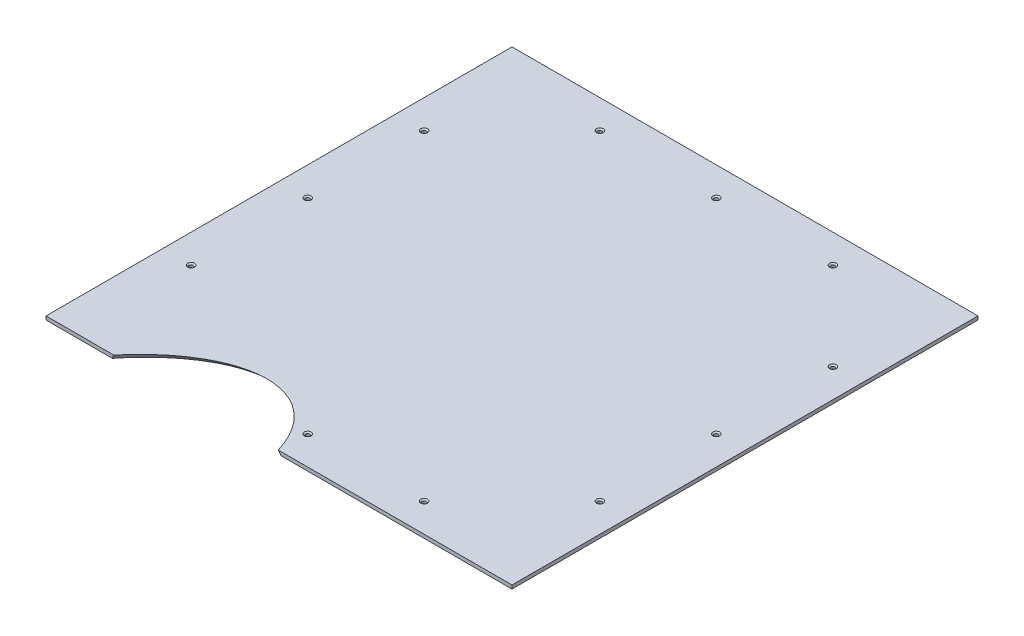
ISO-10303-21;
HEADER;
FILE_DESCRIPTION(('STEP AP214'),'2;1');
FILE_NAME('part.step','',(''),(''),'','','');
FILE_SCHEMA(('AUTOMOTIVE_DESIGN { 1 0 10303 214 1 1 1 1 }'));
ENDSEC;
DATA;
#1=APPLICATION_CONTEXT('core data for automotive mechanical design processes');
#2=APPLICATION_PROTOCOL_DEFINITION('international standard','automotive_design',2000,#1);
#3=PRODUCT_CONTEXT('',#1,'mechanical');
#4=PRODUCT('Part','Part','',(#3));
#5=PRODUCT_RELATED_PRODUCT_CATEGORY('part','',(#4));
#6=PRODUCT_DEFINITION_FORMATION('','',#4);
#7=PRODUCT_DEFINITION_CONTEXT('part definition',#1,'design');
#8=PRODUCT_DEFINITION('design','',#6,#7);
#9=PRODUCT_DEFINITION_SHAPE('','',#8);
#10=(LENGTH_UNIT() NAMED_UNIT(*) SI_UNIT(.MILLI.,.METRE.));
#11=(NAMED_UNIT(*) PLANE_ANGLE_UNIT() SI_UNIT($,.RADIAN.));
#12=(NAMED_UNIT(*) SI_UNIT($,.STERADIAN.) SOLID_ANGLE_UNIT());
#13=UNCERTAINTY_MEASURE_WITH_UNIT(LENGTH_MEASURE(1.E-05),#10,'distance_accuracy_value','');
#14=(GEOMETRIC_REPRESENTATION_CONTEXT(3) GLOBAL_UNCERTAINTY_ASSIGNED_CONTEXT((#13)) GLOBAL_UNIT_ASSIGNED_CONTEXT((#10,
#11,#12)) REPRESENTATION_CONTEXT('',''));
#15=CARTESIAN_POINT('',(0.,0.,0.));
#16=DIRECTION('',(0.,0.,1.));
#17=DIRECTION('',(1.,0.,0.));
#18=AXIS2_PLACEMENT_3D('',#15,#16,#17);
#19=CARTESIAN_POINT('',(103.375714,114.488214,103.375714));
#20=DIRECTION('',(0.,0.,1.));
#21=DIRECTION('',(-1.,0.,0.));
#22=AXIS2_PLACEMENT_3D('',#19,#20,#21);
#23=PLANE('',#22);
#24=CARTESIAN_POINT('',(-28.1609672696657,77.1828253907929,103.375714));
#25=DIRECTION('',(0.,0.,1.));
#26=DIRECTION('',(-0.474989701314118,0.879991354301578,0.));
#27=AXIS2_PLACEMENT_3D('',#24,#25,#26);
#28=ELLIPSE('',#27,62.480622920719,44.45);
#29=CARTESIAN_POINT('',(-73.3172487195405,114.488214,103.375714));
#30=VERTEX_POINT('',#29);
#31=CARTESIAN_POINT('',(-73.9528408774982,112.900714,103.375714));
#32=VERTEX_POINT('',#31);
#33=EDGE_CURVE('E47',#30,#32,#28,.T.);
#34=ORIENTED_EDGE('',*,*,#33,.F.);
#35=DIRECTION('',(-1.,0.,0.));
#36=VECTOR('',#35,1.);
#37=CARTESIAN_POINT('',(103.375714,114.488214,103.375714));
#38=LINE('',#37,#36);
#39=CARTESIAN_POINT('',(-103.375714,114.488214,103.375714));
#40=VERTEX_POINT('',#39);
#41=EDGE_CURVE('E127',#30,#40,#38,.T.);
#42=ORIENTED_EDGE('',*,*,#41,.T.);
#43=DIRECTION('',(0.,-1.,0.));
#44=VECTOR('',#43,1.);
#45=CARTESIAN_POINT('',(-103.375714,114.488214,103.375714));
#46=LINE('',#45,#44);
#47=CARTESIAN_POINT('',(-103.375714,112.900714,103.375714));
#48=VERTEX_POINT('',#47);
#49=EDGE_CURVE('E118',#40,#48,#46,.T.);
#50=ORIENTED_EDGE('',*,*,#49,.T.);
#51=DIRECTION('',(-1.,0.,0.));
#52=VECTOR('',#51,1.);
#53=CARTESIAN_POINT('',(103.375714,112.900714,103.375714));
#54=LINE('',#53,#52);
#55=EDGE_CURVE('E105',#32,#48,#54,.T.);
#56=ORIENTED_EDGE('',*,*,#55,.F.);
#57=EDGE_LOOP('',(#34,#42,#50,#56));
#58=FACE_BOUND('',#57,.T.);
#59=ADVANCED_FACE('F32',(#58),#23,.T.);
#60=CARTESIAN_POINT('',(103.375714,114.488214,103.375714));
#61=DIRECTION('',(1.,0.,0.));
#62=DIRECTION('',(0.,0.,1.));
#63=AXIS2_PLACEMENT_3D('',#60,#61,#62);
#64=PLANE('',#63);
#65=DIRECTION('',(0.,0.,1.));
#66=VECTOR('',#65,1.);
#67=CARTESIAN_POINT('',(103.375714,112.900714,103.375714));
#68=LINE('',#67,#66);
#69=CARTESIAN_POINT('',(103.375714,112.900714,-103.375714));
#70=VERTEX_POINT('',#69);
#71=CARTESIAN_POINT('',(103.375714,112.900714,103.375714));
#72=VERTEX_POINT('',#71);
#73=EDGE_CURVE('E103',#70,#72,#68,.T.);
#74=ORIENTED_EDGE('',*,*,#73,.F.);
#75=DIRECTION('',(0.,-1.,0.));
#76=VECTOR('',#75,1.);
#77=CARTESIAN_POINT('',(103.375714,114.488214,-103.375714));
#78=LINE('',#77,#76);
#79=CARTESIAN_POINT('',(103.375714,114.488214,-103.375714));
#80=VERTEX_POINT('',#79);
#81=EDGE_CURVE('E40',#80,#70,#78,.T.);
#82=ORIENTED_EDGE('',*,*,#81,.F.);
#83=DIRECTION('',(0.,0.,1.));
#84=VECTOR('',#83,1.);
#85=CARTESIAN_POINT('',(103.375714,114.488214,103.375714));
#86=LINE('',#85,#84);
#87=CARTESIAN_POINT('',(103.375714,114.488214,103.375714));
#88=VERTEX_POINT('',#87);
#89=EDGE_CURVE('E114',#80,#88,#86,.T.);
#90=ORIENTED_EDGE('',*,*,#89,.T.);
#91=DIRECTION('',(0.,-1.,0.));
#92=VECTOR('',#91,1.);
#93=CARTESIAN_POINT('',(103.375714,114.488214,103.375714));
#94=LINE('',#93,#92);
#95=EDGE_CURVE('E80',#88,#72,#94,.T.);
#96=ORIENTED_EDGE('',*,*,#95,.T.);
#97=EDGE_LOOP('',(#74,#82,#90,#96));
#98=FACE_BOUND('',#97,.T.);
#99=ADVANCED_FACE('F34',(#98),#64,.T.);
#100=CARTESIAN_POINT('',(103.375714,114.488214,-103.375714));
#101=DIRECTION('',(0.,0.,-1.));
#102=DIRECTION('',(1.,0.,0.));
#103=AXIS2_PLACEMENT_3D('',#100,#101,#102);
#104=PLANE('',#103);
#105=DIRECTION('',(1.,0.,0.));
#106=VECTOR('',#105,1.);
#107=CARTESIAN_POINT('',(103.375714,112.900714,-103.375714));
#108=LINE('',#107,#106);
#109=CARTESIAN_POINT('',(-103.375714,112.900714,-103.375714));
#110=VERTEX_POINT('',#109);
#111=EDGE_CURVE('E108',#110,#70,#108,.T.);
#112=ORIENTED_EDGE('',*,*,#111,.F.);
#113=DIRECTION('',(0.,-1.,0.));
#114=VECTOR('',#113,1.);
#115=CARTESIAN_POINT('',(-103.375714,114.488214,-103.375714));
#116=LINE('',#115,#114);
#117=CARTESIAN_POINT('',(-103.375714,114.488214,-103.375714));
#118=VERTEX_POINT('',#117);
#119=EDGE_CURVE('E116',#118,#110,#116,.T.);
#120=ORIENTED_EDGE('',*,*,#119,.F.);
#121=DIRECTION('',(1.,0.,0.));
#122=VECTOR('',#121,1.);
#123=CARTESIAN_POINT('',(103.375714,114.488214,-103.375714));
#124=LINE('',#123,#122);
#125=EDGE_CURVE('E120',#118,#80,#124,.T.);
#126=ORIENTED_EDGE('',*,*,#125,.T.);
#127=ORIENTED_EDGE('',*,*,#81,.T.);
#128=EDGE_LOOP('',(#112,#120,#126,#127));
#129=FACE_BOUND('',#128,.T.);
#130=ADVANCED_FACE('F239',(#129),#104,.T.);
#131=CARTESIAN_POINT('',(-103.375714,114.488214,103.375714));
#132=DIRECTION('',(-1.,0.,0.));
#133=DIRECTION('',(0.,0.,-1.));
#134=AXIS2_PLACEMENT_3D('',#131,#132,#133);
#135=PLANE('',#134);
#136=DIRECTION('',(0.,0.,-1.));
#137=VECTOR('',#136,1.);
#138=CARTESIAN_POINT('',(-103.375714,112.900714,103.375714));
#139=LINE('',#138,#137);
#140=EDGE_CURVE('E104',#48,#110,#139,.T.);
#141=ORIENTED_EDGE('',*,*,#140,.F.);
#142=ORIENTED_EDGE('',*,*,#49,.F.);
#143=DIRECTION('',(0.,0.,-1.));
#144=VECTOR('',#143,1.);
#145=CARTESIAN_POINT('',(-103.375714,114.488214,103.375714));
#146=LINE('',#145,#144);
#147=EDGE_CURVE('E121',#40,#118,#146,.T.);
#148=ORIENTED_EDGE('',*,*,#147,.T.);
#149=ORIENTED_EDGE('',*,*,#119,.T.);
#150=EDGE_LOOP('',(#141,#142,#148,#149));
#151=FACE_BOUND('',#150,.T.);
#152=ADVANCED_FACE('F238',(#151),#135,.T.);
#153=CARTESIAN_POINT('',(1.03475463813854,112.900714,103.375714));
#154=VERTEX_POINT('',#153);
#155=CARTESIAN_POINT('',(-0.338462050542609,114.488214,103.375714));
#156=VERTEX_POINT('',#155);
#157=EDGE_CURVE('E91',#154,#156,#28,.T.);
#158=ORIENTED_EDGE('',*,*,#157,.F.);
#159=EDGE_CURVE('E97',#72,#154,#54,.T.);
#160=ORIENTED_EDGE('',*,*,#159,.F.);
#161=ORIENTED_EDGE('',*,*,#95,.F.);
#162=EDGE_CURVE('E99',#88,#156,#38,.T.);
#163=ORIENTED_EDGE('',*,*,#162,.T.);
#164=EDGE_LOOP('',(#158,#160,#161,#163));
#165=FACE_BOUND('',#164,.T.);
#166=ADVANCED_FACE('F96',(#165),#23,.T.);
#167=CARTESIAN_POINT('',(103.375714,114.488214,-103.375714));
#168=DIRECTION('',(0.,1.,0.));
#169=DIRECTION('',(0.,0.,-1.));
#170=AXIS2_PLACEMENT_3D('',#167,#168,#169);
#171=PLANE('',#170);
#172=CARTESIAN_POINT('',(-48.29715986551,114.488214,146.290654475134));
#173=DIRECTION('',(0.,1.,0.));
#174=DIRECTION('',(-0.424776533342625,0.,0.905298236340612));
#175=AXIS2_PLACEMENT_3D('',#172,#173,#174);
#176=ELLIPSE('',#175,71.875734671484,44.45);
#177=EDGE_CURVE('E228',#156,#30,#176,.T.);
#178=ORIENTED_EDGE('',*,*,#177,.F.);
#179=ORIENTED_EDGE('',*,*,#162,.F.);
#180=ORIENTED_EDGE('',*,*,#89,.F.);
#181=ORIENTED_EDGE('',*,*,#125,.F.);
#182=ORIENTED_EDGE('',*,*,#147,.F.);
#183=ORIENTED_EDGE('',*,*,#41,.F.);
#184=EDGE_LOOP('',(#178,#179,#180,#181,#182,#183));
#185=FACE_BOUND('',#184,.T.);
#186=CARTESIAN_POINT('',(-90.6757140000005,114.488214,51.6878569999991));
#187=DIRECTION('',(0.,1.,0.));
#188=DIRECTION('',(0.,0.,-1.));
#189=AXIS2_PLACEMENT_3D('',#186,#187,#188);
#190=CIRCLE('',#189,1.51130000000001);
#191=CARTESIAN_POINT('',(-90.6757140000005,114.488214,50.1765569999991));
#192=VERTEX_POINT('',#191);
#193=EDGE_CURVE('E225',#192,#192,#190,.T.);
#194=ORIENTED_EDGE('',*,*,#193,.F.);
#195=EDGE_LOOP('',(#194));
#196=FACE_BOUND('',#195,.T.);
#197=CARTESIAN_POINT('',(-90.675714,114.488214,-9.36190769008373E-13));
#198=DIRECTION('',(0.,1.,0.));
#199=DIRECTION('',(0.,0.,-1.));
#200=AXIS2_PLACEMENT_3D('',#197,#198,#199);
#201=CIRCLE('',#200,1.51129999999999);
#202=CARTESIAN_POINT('',(-90.675714,114.488214,-1.51130000000093));
#203=VERTEX_POINT('',#202);
#204=EDGE_CURVE('E216',#203,#203,#201,.T.);
#205=ORIENTED_EDGE('',*,*,#204,.F.);
#206=EDGE_LOOP('',(#205));
#207=FACE_BOUND('',#206,.T.);
#208=CARTESIAN_POINT('',(-90.6757139999995,114.488214,-51.687857000001));
#209=DIRECTION('',(0.,1.,0.));
#210=DIRECTION('',(0.,0.,-1.));
#211=AXIS2_PLACEMENT_3D('',#208,#209,#210);
#212=CIRCLE('',#211,1.51129999999999);
#213=CARTESIAN_POINT('',(-90.6757139999995,114.488214,-53.1991570000009));
#214=VERTEX_POINT('',#213);
#215=EDGE_CURVE('E207',#214,#214,#212,.T.);
#216=ORIENTED_EDGE('',*,*,#215,.F.);
#217=EDGE_LOOP('',(#216));
#218=FACE_BOUND('',#217,.T.);
#219=CARTESIAN_POINT('',(51.6878569999994,114.488214,90.6757140000004));
#220=DIRECTION('',(0.,1.,0.));
#221=DIRECTION('',(0.,0.,-1.));
#222=AXIS2_PLACEMENT_3D('',#219,#220,#221);
#223=CIRCLE('',#222,1.5113);
#224=CARTESIAN_POINT('',(51.6878569999994,114.488214,89.1644140000004));
#225=VERTEX_POINT('',#224);
#226=EDGE_CURVE('E198',#225,#225,#223,.T.);
#227=ORIENTED_EDGE('',*,*,#226,.F.);
#228=EDGE_LOOP('',(#227));
#229=FACE_BOUND('',#228,.T.);
#230=CARTESIAN_POINT('',(-6.1959802232066E-13,114.488214,90.675714));
#231=DIRECTION('',(0.,1.,0.));
#232=DIRECTION('',(0.,0.,-1.));
#233=AXIS2_PLACEMENT_3D('',#230,#231,#232);
#234=CIRCLE('',#233,1.5113);
#235=CARTESIAN_POINT('',(-6.1959802232066E-13,114.488214,89.164414));
#236=VERTEX_POINT('',#235);
#237=EDGE_CURVE('E189',#236,#236,#234,.T.);
#238=ORIENTED_EDGE('',*,*,#237,.F.);
#239=EDGE_LOOP('',(#238));
#240=FACE_BOUND('',#239,.T.);
#241=CARTESIAN_POINT('',(90.6757140000002,114.488214,-51.6878569999997));
#242=DIRECTION('',(0.,1.,0.));
#243=DIRECTION('',(0.,0.,-1.));
#244=AXIS2_PLACEMENT_3D('',#241,#242,#243);
#245=CIRCLE('',#244,1.51130000000001);
#246=CARTESIAN_POINT('',(90.6757140000002,114.488214,-53.1991569999997));
#247=VERTEX_POINT('',#246);
#248=EDGE_CURVE('E180',#247,#247,#245,.T.);
#249=ORIENTED_EDGE('',*,*,#248,.F.);
#250=EDGE_LOOP('',(#249));
#251=FACE_BOUND('',#250,.T.);
#252=CARTESIAN_POINT('',(90.675714,114.488214,3.03005275632947E-13));
#253=DIRECTION('',(0.,1.,0.));
#254=DIRECTION('',(0.,0.,-1.));
#255=AXIS2_PLACEMENT_3D('',#252,#253,#254);
#256=CIRCLE('',#255,1.51129999999999);
#257=CARTESIAN_POINT('',(90.675714,114.488214,-1.51129999999969));
#258=VERTEX_POINT('',#257);
#259=EDGE_CURVE('E171',#258,#258,#256,.T.);
#260=ORIENTED_EDGE('',*,*,#259,.F.);
#261=EDGE_LOOP('',(#260));
#262=FACE_BOUND('',#261,.T.);
#263=CARTESIAN_POINT('',(90.6757139999998,114.488214,51.6878570000003));
#264=DIRECTION('',(0.,1.,0.));
#265=DIRECTION('',(0.,0.,-1.));
#266=AXIS2_PLACEMENT_3D('',#263,#264,#265);
#267=CIRCLE('',#266,1.51129999999999);
#268=CARTESIAN_POINT('',(90.6757139999998,114.488214,50.1765570000003));
#269=VERTEX_POINT('',#268);
#270=EDGE_CURVE('E162',#269,#269,#267,.T.);
#271=ORIENTED_EDGE('',*,*,#270,.F.);
#272=EDGE_LOOP('',(#271));
#273=FACE_BOUND('',#272,.T.);
#274=CARTESIAN_POINT('',(-51.687857,114.488214,-90.675714));
#275=DIRECTION('',(0.,1.,0.));
#276=DIRECTION('',(0.,0.,-1.));
#277=AXIS2_PLACEMENT_3D('',#274,#275,#276);
#278=CIRCLE('',#277,1.5113);
#279=CARTESIAN_POINT('',(-51.687857,114.488214,-92.187014));
#280=VERTEX_POINT('',#279);
#281=EDGE_CURVE('E153',#280,#280,#278,.T.);
#282=ORIENTED_EDGE('',*,*,#281,.F.);
#283=EDGE_LOOP('',(#282));
#284=FACE_BOUND('',#283,.T.);
#285=CARTESIAN_POINT('',(0.,114.488214,-90.675714));
#286=DIRECTION('',(0.,1.,0.));
#287=DIRECTION('',(0.,0.,-1.));
#288=AXIS2_PLACEMENT_3D('',#285,#286,#287);
#289=CIRCLE('',#288,1.5113);
#290=CARTESIAN_POINT('',(0.,114.488214,-92.187014));
#291=VERTEX_POINT('',#290);
#292=EDGE_CURVE('E144',#291,#291,#289,.T.);
#293=ORIENTED_EDGE('',*,*,#292,.F.);
#294=EDGE_LOOP('',(#293));
#295=FACE_BOUND('',#294,.T.);
#296=CARTESIAN_POINT('',(51.687857,114.488214,-90.675714));
#297=DIRECTION('',(0.,1.,0.));
#298=DIRECTION('',(0.,0.,-1.));
#299=AXIS2_PLACEMENT_3D('',#296,#297,#298);
#300=CIRCLE('',#299,1.5113);
#301=CARTESIAN_POINT('',(51.687857,114.488214,-92.187014));
#302=VERTEX_POINT('',#301);
#303=EDGE_CURVE('E135',#302,#302,#300,.T.);
#304=ORIENTED_EDGE('',*,*,#303,.F.);
#305=EDGE_LOOP('',(#304));
#306=FACE_BOUND('',#305,.T.);
#307=ADVANCED_FACE('F234',(#185,#196,#207,#218,#229,#240,#251,#262,#273,#284,#295,#306),#171,.T.);
#308=CARTESIAN_POINT('',(103.375714,112.900714,-103.375714));
#309=DIRECTION('',(0.,1.,0.));
#310=DIRECTION('',(0.,0.,-1.));
#311=AXIS2_PLACEMENT_3D('',#308,#309,#310);
#312=PLANE('',#311);
#313=CARTESIAN_POINT('',(-90.6757140000005,112.900714,51.6878569999991));
#314=DIRECTION('',(0.,1.,0.));
#315=DIRECTION('',(0.,0.,-1.));
#316=AXIS2_PLACEMENT_3D('',#313,#314,#315);
#317=CIRCLE('',#316,0.889000000000001);
#318=CARTESIAN_POINT('',(-90.6757140000005,112.900714,50.7988569999991));
#319=VERTEX_POINT('',#318);
#320=EDGE_CURVE('E219',#319,#319,#317,.T.);
#321=ORIENTED_EDGE('',*,*,#320,.T.);
#322=EDGE_LOOP('',(#321));
#323=FACE_BOUND('',#322,.T.);
#324=CARTESIAN_POINT('',(-90.675714,112.900714,-9.36190769008373E-13));
#325=DIRECTION('',(0.,1.,0.));
#326=DIRECTION('',(0.,0.,-1.));
#327=AXIS2_PLACEMENT_3D('',#324,#325,#326);
#328=CIRCLE('',#327,0.889000000000001);
#329=CARTESIAN_POINT('',(-90.675714,112.900714,-0.889000000000937));
#330=VERTEX_POINT('',#329);
#331=EDGE_CURVE('E210',#330,#330,#328,.T.);
#332=ORIENTED_EDGE('',*,*,#331,.T.);
#333=EDGE_LOOP('',(#332));
#334=FACE_BOUND('',#333,.T.);
#335=CARTESIAN_POINT('',(-90.6757139999995,112.900714,-51.687857000001));
#336=DIRECTION('',(0.,1.,0.));
#337=DIRECTION('',(0.,0.,-1.));
#338=AXIS2_PLACEMENT_3D('',#335,#336,#337);
#339=CIRCLE('',#338,0.889000000000001);
#340=CARTESIAN_POINT('',(-90.6757139999995,112.900714,-52.576857000001));
#341=VERTEX_POINT('',#340);
#342=EDGE_CURVE('E201',#341,#341,#339,.T.);
#343=ORIENTED_EDGE('',*,*,#342,.T.);
#344=EDGE_LOOP('',(#343));
#345=FACE_BOUND('',#344,.T.);
#346=CARTESIAN_POINT('',(51.6878569999994,112.900714,90.6757140000004));
#347=DIRECTION('',(0.,1.,0.));
#348=DIRECTION('',(0.,0.,-1.));
#349=AXIS2_PLACEMENT_3D('',#346,#347,#348);
#350=CIRCLE('',#349,0.889000000000001);
#351=CARTESIAN_POINT('',(51.6878569999994,112.900714,89.7867140000004));
#352=VERTEX_POINT('',#351);
#353=EDGE_CURVE('E192',#352,#352,#350,.T.);
#354=ORIENTED_EDGE('',*,*,#353,.T.);
#355=EDGE_LOOP('',(#354));
#356=FACE_BOUND('',#355,.T.);
#357=CARTESIAN_POINT('',(-6.1959802232066E-13,112.900714,90.675714));
#358=DIRECTION('',(0.,1.,0.));
#359=DIRECTION('',(0.,0.,-1.));
#360=AXIS2_PLACEMENT_3D('',#357,#358,#359);
#361=CIRCLE('',#360,0.889);
#362=CARTESIAN_POINT('',(-6.1959802232066E-13,112.900714,89.786714));
#363=VERTEX_POINT('',#362);
#364=EDGE_CURVE('E183',#363,#363,#361,.T.);
#365=ORIENTED_EDGE('',*,*,#364,.T.);
#366=EDGE_LOOP('',(#365));
#367=FACE_BOUND('',#366,.T.);
#368=CARTESIAN_POINT('',(90.6757140000002,112.900714,-51.6878569999997));
#369=DIRECTION('',(0.,1.,0.));
#370=DIRECTION('',(0.,0.,-1.));
#371=AXIS2_PLACEMENT_3D('',#368,#369,#370);
#372=CIRCLE('',#371,0.889000000000001);
#373=CARTESIAN_POINT('',(90.6757140000002,112.900714,-52.5768569999997));
#374=VERTEX_POINT('',#373);
#375=EDGE_CURVE('E174',#374,#374,#372,.T.);
#376=ORIENTED_EDGE('',*,*,#375,.T.);
#377=EDGE_LOOP('',(#376));
#378=FACE_BOUND('',#377,.T.);
#379=CARTESIAN_POINT('',(90.675714,112.900714,3.03005275632947E-13));
#380=DIRECTION('',(0.,1.,0.));
#381=DIRECTION('',(0.,0.,-1.));
#382=AXIS2_PLACEMENT_3D('',#379,#380,#381);
#383=CIRCLE('',#382,0.889000000000001);
#384=CARTESIAN_POINT('',(90.675714,112.900714,-0.888999999999698));
#385=VERTEX_POINT('',#384);
#386=EDGE_CURVE('E165',#385,#385,#383,.T.);
#387=ORIENTED_EDGE('',*,*,#386,.T.);
#388=EDGE_LOOP('',(#387));
#389=FACE_BOUND('',#388,.T.);
#390=CARTESIAN_POINT('',(90.6757139999998,112.900714,51.6878570000003));
#391=DIRECTION('',(0.,1.,0.));
#392=DIRECTION('',(0.,0.,-1.));
#393=AXIS2_PLACEMENT_3D('',#390,#391,#392);
#394=CIRCLE('',#393,0.889000000000001);
#395=CARTESIAN_POINT('',(90.6757139999998,112.900714,50.7988570000003));
#396=VERTEX_POINT('',#395);
#397=EDGE_CURVE('E156',#396,#396,#394,.T.);
#398=ORIENTED_EDGE('',*,*,#397,.T.);
#399=EDGE_LOOP('',(#398));
#400=FACE_BOUND('',#399,.T.);
#401=CARTESIAN_POINT('',(-51.687857,112.900714,-90.675714));
#402=DIRECTION('',(0.,1.,0.));
#403=DIRECTION('',(0.,0.,-1.));
#404=AXIS2_PLACEMENT_3D('',#401,#402,#403);
#405=CIRCLE('',#404,0.889000000000001);
#406=CARTESIAN_POINT('',(-51.687857,112.900714,-91.564714));
#407=VERTEX_POINT('',#406);
#408=EDGE_CURVE('E147',#407,#407,#405,.T.);
#409=ORIENTED_EDGE('',*,*,#408,.T.);
#410=EDGE_LOOP('',(#409));
#411=FACE_BOUND('',#410,.T.);
#412=CARTESIAN_POINT('',(0.,112.900714,-90.675714));
#413=DIRECTION('',(0.,1.,0.));
#414=DIRECTION('',(0.,0.,-1.));
#415=AXIS2_PLACEMENT_3D('',#412,#413,#414);
#416=CIRCLE('',#415,0.889);
#417=CARTESIAN_POINT('',(0.,112.900714,-91.564714));
#418=VERTEX_POINT('',#417);
#419=EDGE_CURVE('E138',#418,#418,#416,.T.);
#420=ORIENTED_EDGE('',*,*,#419,.T.);
#421=EDGE_LOOP('',(#420));
#422=FACE_BOUND('',#421,.T.);
#423=CARTESIAN_POINT('',(51.687857,112.900714,-90.675714));
#424=DIRECTION('',(0.,1.,0.));
#425=DIRECTION('',(0.,0.,-1.));
#426=AXIS2_PLACEMENT_3D('',#423,#424,#425);
#427=CIRCLE('',#426,0.889000000000001);
#428=CARTESIAN_POINT('',(51.687857,112.900714,-91.564714));
#429=VERTEX_POINT('',#428);
#430=EDGE_CURVE('E129',#429,#429,#427,.T.);
#431=ORIENTED_EDGE('',*,*,#430,.T.);
#432=EDGE_LOOP('',(#431));
#433=FACE_BOUND('',#432,.T.);
#434=ORIENTED_EDGE('',*,*,#159,.T.);
#435=CARTESIAN_POINT('',(-47.4402808210168,112.900714,144.464444628671));
#436=DIRECTION('',(0.,1.,0.));
#437=DIRECTION('',(-0.424776533342625,0.,0.905298236340612));
#438=AXIS2_PLACEMENT_3D('',#435,#436,#437);
#439=ELLIPSE('',#438,71.875734671484,44.45);
#440=EDGE_CURVE('E11',#154,#32,#439,.T.);
#441=ORIENTED_EDGE('',*,*,#440,.T.);
#442=ORIENTED_EDGE('',*,*,#55,.T.);
#443=ORIENTED_EDGE('',*,*,#140,.T.);
#444=ORIENTED_EDGE('',*,*,#111,.T.);
#445=ORIENTED_EDGE('',*,*,#73,.T.);
#446=EDGE_LOOP('',(#434,#441,#442,#443,#444,#445));
#447=FACE_BOUND('',#446,.T.);
#448=ADVANCED_FACE('F101',(#323,#334,#345,#356,#367,#378,#389,#400,#411,#422,#433,#447),#312,.F.);
#449=CARTESIAN_POINT('',(51.687857,114.488214,-90.675714));
#450=DIRECTION('',(0.,1.,0.));
#451=DIRECTION('',(0.,0.,-1.));
#452=AXIS2_PLACEMENT_3D('',#449,#450,#451);
#453=CYLINDRICAL_SURFACE('',#452,0.888999999999997);
#454=ORIENTED_EDGE('',*,*,#430,.F.);
#455=EDGE_LOOP('',(#454));
#456=FACE_BOUND('',#455,.T.);
#457=CARTESIAN_POINT('',(51.687857,113.966042299518,-90.675714));
#458=DIRECTION('',(0.,1.,0.));
#459=DIRECTION('',(0.,0.,-1.));
#460=AXIS2_PLACEMENT_3D('',#457,#458,#459);
#461=CIRCLE('',#460,0.888999999999994);
#462=CARTESIAN_POINT('',(51.687857,113.966042299518,-91.564714));
#463=VERTEX_POINT('',#462);
#464=EDGE_CURVE('E132',#463,#463,#461,.T.);
#465=ORIENTED_EDGE('',*,*,#464,.T.);
#466=EDGE_LOOP('',(#465));
#467=FACE_BOUND('',#466,.T.);
#468=ADVANCED_FACE('F259',(#456,#467),#453,.F.);
#469=CARTESIAN_POINT('',(51.687857,114.488214,-90.675714));
#470=DIRECTION('',(0.,1.,0.));
#471=DIRECTION('',(0.,0.,-1.));
#472=AXIS2_PLACEMENT_3D('',#469,#470,#471);
#473=CONICAL_SURFACE('',#472,1.5113,0.872664625997172);
#474=ORIENTED_EDGE('',*,*,#464,.F.);
#475=EDGE_LOOP('',(#474));
#476=FACE_BOUND('',#475,.T.);
#477=ORIENTED_EDGE('',*,*,#303,.T.);
#478=EDGE_LOOP('',(#477));
#479=FACE_BOUND('',#478,.T.);
#480=ADVANCED_FACE('F264',(#476,#479),#473,.F.);
#481=CARTESIAN_POINT('',(0.,114.488214,-90.675714));
#482=DIRECTION('',(0.,1.,0.));
#483=DIRECTION('',(0.,0.,-1.));
#484=AXIS2_PLACEMENT_3D('',#481,#482,#483);
#485=CYLINDRICAL_SURFACE('',#484,0.888999999999998);
#486=ORIENTED_EDGE('',*,*,#419,.F.);
#487=EDGE_LOOP('',(#486));
#488=FACE_BOUND('',#487,.T.);
#489=CARTESIAN_POINT('',(0.,113.966042299518,-90.675714));
#490=DIRECTION('',(0.,1.,0.));
#491=DIRECTION('',(0.,0.,-1.));
#492=AXIS2_PLACEMENT_3D('',#489,#490,#491);
#493=CIRCLE('',#492,0.888999999999997);
#494=CARTESIAN_POINT('',(0.,113.966042299518,-91.564714));
#495=VERTEX_POINT('',#494);
#496=EDGE_CURVE('E141',#495,#495,#493,.T.);
#497=ORIENTED_EDGE('',*,*,#496,.T.);
#498=EDGE_LOOP('',(#497));
#499=FACE_BOUND('',#498,.T.);
#500=ADVANCED_FACE('F268',(#488,#499),#485,.F.);
#501=CARTESIAN_POINT('',(0.,114.488214,-90.675714));
#502=DIRECTION('',(0.,1.,0.));
#503=DIRECTION('',(0.,0.,-1.));
#504=AXIS2_PLACEMENT_3D('',#501,#502,#503);
#505=CONICAL_SURFACE('',#504,1.5113,0.87266462599717);
#506=ORIENTED_EDGE('',*,*,#496,.F.);
#507=EDGE_LOOP('',(#506));
#508=FACE_BOUND('',#507,.T.);
#509=ORIENTED_EDGE('',*,*,#292,.T.);
#510=EDGE_LOOP('',(#509));
#511=FACE_BOUND('',#510,.T.);
#512=ADVANCED_FACE('F272',(#508,#511),#505,.F.);
#513=CARTESIAN_POINT('',(-51.687857,114.488214,-90.675714));
#514=DIRECTION('',(0.,1.,0.));
#515=DIRECTION('',(0.,0.,-1.));
#516=AXIS2_PLACEMENT_3D('',#513,#514,#515);
#517=CYLINDRICAL_SURFACE('',#516,0.888999999999997);
#518=ORIENTED_EDGE('',*,*,#408,.F.);
#519=EDGE_LOOP('',(#518));
#520=FACE_BOUND('',#519,.T.);
#521=CARTESIAN_POINT('',(-51.687857,113.966042299518,-90.675714));
#522=DIRECTION('',(0.,1.,0.));
#523=DIRECTION('',(0.,0.,-1.));
#524=AXIS2_PLACEMENT_3D('',#521,#522,#523);
#525=CIRCLE('',#524,0.888999999999994);
#526=CARTESIAN_POINT('',(-51.687857,113.966042299518,-91.564714));
#527=VERTEX_POINT('',#526);
#528=EDGE_CURVE('E150',#527,#527,#525,.T.);
#529=ORIENTED_EDGE('',*,*,#528,.T.);
#530=EDGE_LOOP('',(#529));
#531=FACE_BOUND('',#530,.T.);
#532=ADVANCED_FACE('F276',(#520,#531),#517,.F.);
#533=CARTESIAN_POINT('',(-51.687857,114.488214,-90.675714));
#534=DIRECTION('',(0.,1.,0.));
#535=DIRECTION('',(0.,0.,-1.));
#536=AXIS2_PLACEMENT_3D('',#533,#534,#535);
#537=CONICAL_SURFACE('',#536,1.5113,0.872664625997172);
#538=ORIENTED_EDGE('',*,*,#528,.F.);
#539=EDGE_LOOP('',(#538));
#540=FACE_BOUND('',#539,.T.);
#541=ORIENTED_EDGE('',*,*,#281,.T.);
#542=EDGE_LOOP('',(#541));
#543=FACE_BOUND('',#542,.T.);
#544=ADVANCED_FACE('F280',(#540,#543),#537,.F.);
#545=CARTESIAN_POINT('',(90.6757139999998,114.488214,51.6878570000003));
#546=DIRECTION('',(0.,1.,0.));
#547=DIRECTION('',(0.,0.,-1.));
#548=AXIS2_PLACEMENT_3D('',#545,#546,#547);
#549=CYLINDRICAL_SURFACE('',#548,0.889000000000001);
#550=ORIENTED_EDGE('',*,*,#397,.F.);
#551=EDGE_LOOP('',(#550));
#552=FACE_BOUND('',#551,.T.);
#553=CARTESIAN_POINT('',(90.6757139999998,113.966042299518,51.6878570000003));
#554=DIRECTION('',(0.,1.,0.));
#555=DIRECTION('',(0.,0.,-1.));
#556=AXIS2_PLACEMENT_3D('',#553,#554,#555);
#557=CIRCLE('',#556,0.889000000000001);
#558=CARTESIAN_POINT('',(90.6757139999998,113.966042299518,50.7988570000003));
#559=VERTEX_POINT('',#558);
#560=EDGE_CURVE('E159',#559,#559,#557,.T.);
#561=ORIENTED_EDGE('',*,*,#560,.T.);
#562=EDGE_LOOP('',(#561));
#563=FACE_BOUND('',#562,.T.);
#564=ADVANCED_FACE('F284',(#552,#563),#549,.F.);
#565=CARTESIAN_POINT('',(90.6757139999998,114.488214,51.6878570000003));
#566=DIRECTION('',(0.,1.,0.));
#567=DIRECTION('',(0.,0.,-1.));
#568=AXIS2_PLACEMENT_3D('',#565,#566,#567);
#569=CONICAL_SURFACE('',#568,1.51129999999999,0.872664625997161);
#570=ORIENTED_EDGE('',*,*,#560,.F.);
#571=EDGE_LOOP('',(#570));
#572=FACE_BOUND('',#571,.T.);
#573=ORIENTED_EDGE('',*,*,#270,.T.);
#574=EDGE_LOOP('',(#573));
#575=FACE_BOUND('',#574,.T.);
#576=ADVANCED_FACE('F288',(#572,#575),#569,.F.);
#577=CARTESIAN_POINT('',(90.675714,114.488214,3.03005275632947E-13));
#578=DIRECTION('',(0.,1.,0.));
#579=DIRECTION('',(0.,0.,-1.));
#580=AXIS2_PLACEMENT_3D('',#577,#578,#579);
#581=CYLINDRICAL_SURFACE('',#580,0.889000000000001);
#582=ORIENTED_EDGE('',*,*,#386,.F.);
#583=EDGE_LOOP('',(#582));
#584=FACE_BOUND('',#583,.T.);
#585=CARTESIAN_POINT('',(90.675714,113.966042299518,3.03005275632947E-13));
#586=DIRECTION('',(0.,1.,0.));
#587=DIRECTION('',(0.,0.,-1.));
#588=AXIS2_PLACEMENT_3D('',#585,#586,#587);
#589=CIRCLE('',#588,0.889000000000001);
#590=CARTESIAN_POINT('',(90.675714,113.966042299518,-0.888999999999698));
#591=VERTEX_POINT('',#590);
#592=EDGE_CURVE('E168',#591,#591,#589,.T.);
#593=ORIENTED_EDGE('',*,*,#592,.T.);
#594=EDGE_LOOP('',(#593));
#595=FACE_BOUND('',#594,.T.);
#596=ADVANCED_FACE('F292',(#584,#595),#581,.F.);
#597=CARTESIAN_POINT('',(90.675714,114.488214,3.03005275632947E-13));
#598=DIRECTION('',(0.,1.,0.));
#599=DIRECTION('',(0.,0.,-1.));
#600=AXIS2_PLACEMENT_3D('',#597,#598,#599);
#601=CONICAL_SURFACE('',#600,1.51129999999999,0.872664625997161);
#602=ORIENTED_EDGE('',*,*,#592,.F.);
#603=EDGE_LOOP('',(#602));
#604=FACE_BOUND('',#603,.T.);
#605=ORIENTED_EDGE('',*,*,#259,.T.);
#606=EDGE_LOOP('',(#605));
#607=FACE_BOUND('',#606,.T.);
#608=ADVANCED_FACE('F296',(#604,#607),#601,.F.);
#609=CARTESIAN_POINT('',(90.6757140000002,114.488214,-51.6878569999997));
#610=DIRECTION('',(0.,1.,0.));
#611=DIRECTION('',(0.,0.,-1.));
#612=AXIS2_PLACEMENT_3D('',#609,#610,#611);
#613=CYLINDRICAL_SURFACE('',#612,0.889000000000001);
#614=ORIENTED_EDGE('',*,*,#375,.F.);
#615=EDGE_LOOP('',(#614));
#616=FACE_BOUND('',#615,.T.);
#617=CARTESIAN_POINT('',(90.6757140000002,113.966042299518,-51.6878569999997));
#618=DIRECTION('',(0.,1.,0.));
#619=DIRECTION('',(0.,0.,-1.));
#620=AXIS2_PLACEMENT_3D('',#617,#618,#619);
#621=CIRCLE('',#620,0.889000000000001);
#622=CARTESIAN_POINT('',(90.6757140000002,113.966042299518,-52.5768569999997));
#623=VERTEX_POINT('',#622);
#624=EDGE_CURVE('E177',#623,#623,#621,.T.);
#625=ORIENTED_EDGE('',*,*,#624,.T.);
#626=EDGE_LOOP('',(#625));
#627=FACE_BOUND('',#626,.T.);
#628=ADVANCED_FACE('F300',(#616,#627),#613,.F.);
#629=CARTESIAN_POINT('',(90.6757140000002,114.488214,-51.6878569999997));
#630=DIRECTION('',(0.,1.,0.));
#631=DIRECTION('',(0.,0.,-1.));
#632=AXIS2_PLACEMENT_3D('',#629,#630,#631);
#633=CONICAL_SURFACE('',#632,1.51130000000001,0.872664625997172);
#634=ORIENTED_EDGE('',*,*,#624,.F.);
#635=EDGE_LOOP('',(#634));
#636=FACE_BOUND('',#635,.T.);
#637=ORIENTED_EDGE('',*,*,#248,.T.);
#638=EDGE_LOOP('',(#637));
#639=FACE_BOUND('',#638,.T.);
#640=ADVANCED_FACE('F304',(#636,#639),#633,.F.);
#641=CARTESIAN_POINT('',(-6.1959802232066E-13,114.488214,90.675714));
#642=DIRECTION('',(0.,1.,0.));
#643=DIRECTION('',(0.,0.,-1.));
#644=AXIS2_PLACEMENT_3D('',#641,#642,#643);
#645=CYLINDRICAL_SURFACE('',#644,0.888999999999998);
#646=ORIENTED_EDGE('',*,*,#364,.F.);
#647=EDGE_LOOP('',(#646));
#648=FACE_BOUND('',#647,.T.);
#649=CARTESIAN_POINT('',(-6.1959802232066E-13,113.966042299518,90.675714));
#650=DIRECTION('',(0.,1.,0.));
#651=DIRECTION('',(0.,0.,-1.));
#652=AXIS2_PLACEMENT_3D('',#649,#650,#651);
#653=CIRCLE('',#652,0.888999999999997);
#654=CARTESIAN_POINT('',(-6.1959802232066E-13,113.966042299518,89.786714));
#655=VERTEX_POINT('',#654);
#656=EDGE_CURVE('E186',#655,#655,#653,.T.);
#657=ORIENTED_EDGE('',*,*,#656,.T.);
#658=EDGE_LOOP('',(#657));
#659=FACE_BOUND('',#658,.T.);
#660=ADVANCED_FACE('F308',(#648,#659),#645,.F.);
#661=CARTESIAN_POINT('',(-6.1959802232066E-13,114.488214,90.675714));
#662=DIRECTION('',(0.,1.,0.));
#663=DIRECTION('',(0.,0.,-1.));
#664=AXIS2_PLACEMENT_3D('',#661,#662,#663);
#665=CONICAL_SURFACE('',#664,1.5113,0.87266462599717);
#666=ORIENTED_EDGE('',*,*,#656,.F.);
#667=EDGE_LOOP('',(#666));
#668=FACE_BOUND('',#667,.T.);
#669=ORIENTED_EDGE('',*,*,#237,.T.);
#670=EDGE_LOOP('',(#669));
#671=FACE_BOUND('',#670,.T.);
#672=ADVANCED_FACE('F312',(#668,#671),#665,.F.);
#673=CARTESIAN_POINT('',(51.6878569999994,114.488214,90.6757140000004));
#674=DIRECTION('',(0.,1.,0.));
#675=DIRECTION('',(0.,0.,-1.));
#676=AXIS2_PLACEMENT_3D('',#673,#674,#675);
#677=CYLINDRICAL_SURFACE('',#676,0.888999999999997);
#678=ORIENTED_EDGE('',*,*,#353,.F.);
#679=EDGE_LOOP('',(#678));
#680=FACE_BOUND('',#679,.T.);
#681=CARTESIAN_POINT('',(51.6878569999994,113.966042299518,90.6757140000004));
#682=DIRECTION('',(0.,1.,0.));
#683=DIRECTION('',(0.,0.,-1.));
#684=AXIS2_PLACEMENT_3D('',#681,#682,#683);
#685=CIRCLE('',#684,0.888999999999994);
#686=CARTESIAN_POINT('',(51.6878569999994,113.966042299518,89.7867140000004));
#687=VERTEX_POINT('',#686);
#688=EDGE_CURVE('E195',#687,#687,#685,.T.);
#689=ORIENTED_EDGE('',*,*,#688,.T.);
#690=EDGE_LOOP('',(#689));
#691=FACE_BOUND('',#690,.T.);
#692=ADVANCED_FACE('F316',(#680,#691),#677,.F.);
#693=CARTESIAN_POINT('',(51.6878569999994,114.488214,90.6757140000004));
#694=DIRECTION('',(0.,1.,0.));
#695=DIRECTION('',(0.,0.,-1.));
#696=AXIS2_PLACEMENT_3D('',#693,#694,#695);
#697=CONICAL_SURFACE('',#696,1.5113,0.872664625997172);
#698=ORIENTED_EDGE('',*,*,#688,.F.);
#699=EDGE_LOOP('',(#698));
#700=FACE_BOUND('',#699,.T.);
#701=ORIENTED_EDGE('',*,*,#226,.T.);
#702=EDGE_LOOP('',(#701));
#703=FACE_BOUND('',#702,.T.);
#704=ADVANCED_FACE('F320',(#700,#703),#697,.F.);
#705=CARTESIAN_POINT('',(-90.6757139999995,114.488214,-51.687857000001));
#706=DIRECTION('',(0.,1.,0.));
#707=DIRECTION('',(0.,0.,-1.));
#708=AXIS2_PLACEMENT_3D('',#705,#706,#707);
#709=CYLINDRICAL_SURFACE('',#708,0.889000000000001);
#710=ORIENTED_EDGE('',*,*,#342,.F.);
#711=EDGE_LOOP('',(#710));
#712=FACE_BOUND('',#711,.T.);
#713=CARTESIAN_POINT('',(-90.6757139999995,113.966042299518,-51.687857000001));
#714=DIRECTION('',(0.,1.,0.));
#715=DIRECTION('',(0.,0.,-1.));
#716=AXIS2_PLACEMENT_3D('',#713,#714,#715);
#717=CIRCLE('',#716,0.889000000000001);
#718=CARTESIAN_POINT('',(-90.6757139999995,113.966042299518,-52.576857000001));
#719=VERTEX_POINT('',#718);
#720=EDGE_CURVE('E204',#719,#719,#717,.T.);
#721=ORIENTED_EDGE('',*,*,#720,.T.);
#722=EDGE_LOOP('',(#721));
#723=FACE_BOUND('',#722,.T.);
#724=ADVANCED_FACE('F324',(#712,#723),#709,.F.);
#725=CARTESIAN_POINT('',(-90.6757139999995,114.488214,-51.687857000001));
#726=DIRECTION('',(0.,1.,0.));
#727=DIRECTION('',(0.,0.,-1.));
#728=AXIS2_PLACEMENT_3D('',#725,#726,#727);
#729=CONICAL_SURFACE('',#728,1.51129999999999,0.872664625997161);
#730=ORIENTED_EDGE('',*,*,#720,.F.);
#731=EDGE_LOOP('',(#730));
#732=FACE_BOUND('',#731,.T.);
#733=ORIENTED_EDGE('',*,*,#215,.T.);
#734=EDGE_LOOP('',(#733));
#735=FACE_BOUND('',#734,.T.);
#736=ADVANCED_FACE('F328',(#732,#735),#729,.F.);
#737=CARTESIAN_POINT('',(-90.675714,114.488214,-9.36190769008373E-13));
#738=DIRECTION('',(0.,1.,0.));
#739=DIRECTION('',(0.,0.,-1.));
#740=AXIS2_PLACEMENT_3D('',#737,#738,#739);
#741=CYLINDRICAL_SURFACE('',#740,0.889000000000001);
#742=ORIENTED_EDGE('',*,*,#331,.F.);
#743=EDGE_LOOP('',(#742));
#744=FACE_BOUND('',#743,.T.);
#745=CARTESIAN_POINT('',(-90.675714,113.966042299518,-9.36190769008373E-13));
#746=DIRECTION('',(0.,1.,0.));
#747=DIRECTION('',(0.,0.,-1.));
#748=AXIS2_PLACEMENT_3D('',#745,#746,#747);
#749=CIRCLE('',#748,0.889000000000001);
#750=CARTESIAN_POINT('',(-90.675714,113.966042299518,-0.889000000000937));
#751=VERTEX_POINT('',#750);
#752=EDGE_CURVE('E213',#751,#751,#749,.T.);
#753=ORIENTED_EDGE('',*,*,#752,.T.);
#754=EDGE_LOOP('',(#753));
#755=FACE_BOUND('',#754,.T.);
#756=ADVANCED_FACE('F332',(#744,#755),#741,.F.);
#757=CARTESIAN_POINT('',(-90.675714,114.488214,-9.36190769008373E-13));
#758=DIRECTION('',(0.,1.,0.));
#759=DIRECTION('',(0.,0.,-1.));
#760=AXIS2_PLACEMENT_3D('',#757,#758,#759);
#761=CONICAL_SURFACE('',#760,1.51129999999999,0.872664625997161);
#762=ORIENTED_EDGE('',*,*,#752,.F.);
#763=EDGE_LOOP('',(#762));
#764=FACE_BOUND('',#763,.T.);
#765=ORIENTED_EDGE('',*,*,#204,.T.);
#766=EDGE_LOOP('',(#765));
#767=FACE_BOUND('',#766,.T.);
#768=ADVANCED_FACE('F336',(#764,#767),#761,.F.);
#769=CARTESIAN_POINT('',(-90.6757140000005,114.488214,51.6878569999991));
#770=DIRECTION('',(0.,1.,0.));
#771=DIRECTION('',(0.,0.,-1.));
#772=AXIS2_PLACEMENT_3D('',#769,#770,#771);
#773=CYLINDRICAL_SURFACE('',#772,0.889000000000001);
#774=ORIENTED_EDGE('',*,*,#320,.F.);
#775=EDGE_LOOP('',(#774));
#776=FACE_BOUND('',#775,.T.);
#777=CARTESIAN_POINT('',(-90.6757140000005,113.966042299518,51.6878569999991));
#778=DIRECTION('',(0.,1.,0.));
#779=DIRECTION('',(0.,0.,-1.));
#780=AXIS2_PLACEMENT_3D('',#777,#778,#779);
#781=CIRCLE('',#780,0.889000000000001);
#782=CARTESIAN_POINT('',(-90.6757140000005,113.966042299518,50.7988569999991));
#783=VERTEX_POINT('',#782);
#784=EDGE_CURVE('E222',#783,#783,#781,.T.);
#785=ORIENTED_EDGE('',*,*,#784,.T.);
#786=EDGE_LOOP('',(#785));
#787=FACE_BOUND('',#786,.T.);
#788=ADVANCED_FACE('F340',(#776,#787),#773,.F.);
#789=CARTESIAN_POINT('',(-90.6757140000005,114.488214,51.6878569999991));
#790=DIRECTION('',(0.,1.,0.));
#791=DIRECTION('',(0.,0.,-1.));
#792=AXIS2_PLACEMENT_3D('',#789,#790,#791);
#793=CONICAL_SURFACE('',#792,1.51130000000001,0.872664625997172);
#794=ORIENTED_EDGE('',*,*,#784,.F.);
#795=EDGE_LOOP('',(#794));
#796=FACE_BOUND('',#795,.T.);
#797=ORIENTED_EDGE('',*,*,#193,.T.);
#798=EDGE_LOOP('',(#797));
#799=FACE_BOUND('',#798,.T.);
#800=ADVANCED_FACE('F344',(#796,#799),#793,.F.);
#801=CARTESIAN_POINT('',(28.221049171978,-27.2735172824649,-16.7875625451675));
#802=DIRECTION('',(-0.333806859233772,0.618428461332098,0.711420564042745));
#803=DIRECTION('',(0.,-0.754709580222772,0.656059028990507));
#804=AXIS2_PLACEMENT_3D('',#801,#802,#803);
#805=CYLINDRICAL_SURFACE('',#804,44.45);
#806=ORIENTED_EDGE('',*,*,#177,.T.);
#807=ORIENTED_EDGE('',*,*,#33,.T.);
#808=ORIENTED_EDGE('',*,*,#440,.F.);
#809=ORIENTED_EDGE('',*,*,#157,.T.);
#810=EDGE_LOOP('',(#806,#807,#808,#809));
#811=FACE_BOUND('',#810,.T.);
#812=ADVANCED_FACE('F90',(#811),#805,.F.);
#813=CLOSED_SHELL('',(#59,#99,#130,#152,#166,#307,#448,#468,#480,#500,#512,#532,#544,#564,#576,
#596,#608,#628,#640,#660,#672,#692,#704,#724,#736,#756,#768,#788,#800,#812));
#814=MANIFOLD_SOLID_BREP('B2',#813);
#815=ADVANCED_BREP_SHAPE_REPRESENTATION('',(#18,#814),#14);
#816=SHAPE_DEFINITION_REPRESENTATION(#9,#815);
ENDSEC;
END-ISO-10303-21;
